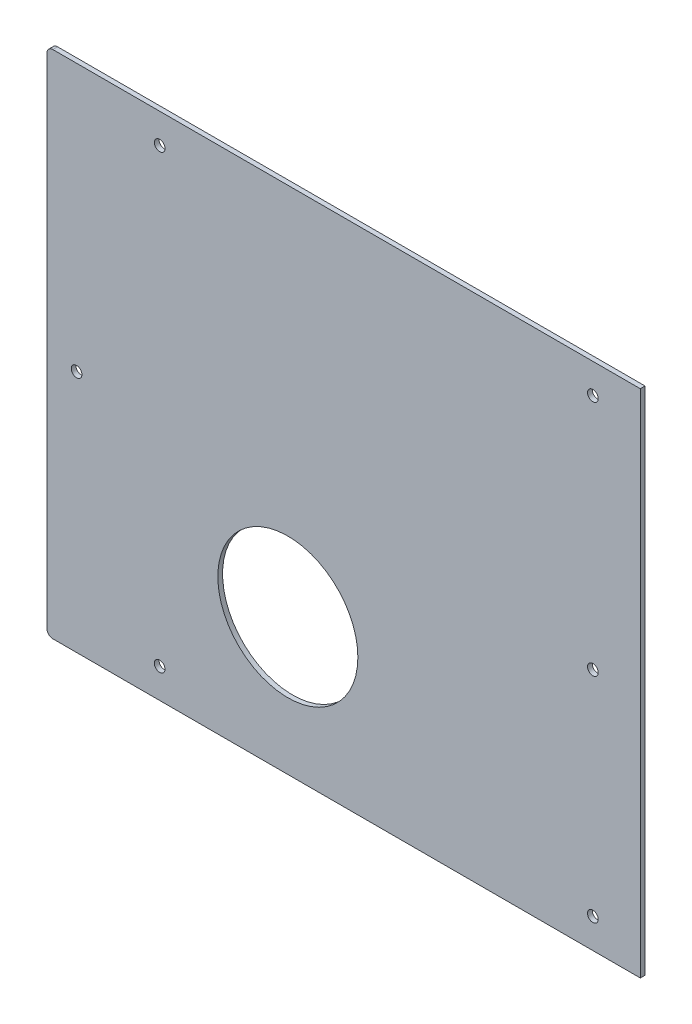
ISO-10303-21;
HEADER;
FILE_DESCRIPTION(('STEP AP214'),'2;1');
FILE_NAME('part.step','',(''),(''),'','','');
FILE_SCHEMA(('AUTOMOTIVE_DESIGN { 1 0 10303 214 1 1 1 1 }'));
ENDSEC;
DATA;
#1=APPLICATION_CONTEXT('core data for automotive mechanical design processes');
#2=APPLICATION_PROTOCOL_DEFINITION('international standard','automotive_design',2000,#1);
#3=PRODUCT_CONTEXT('',#1,'mechanical');
#4=PRODUCT('Part','Part','',(#3));
#5=PRODUCT_RELATED_PRODUCT_CATEGORY('part','',(#4));
#6=PRODUCT_DEFINITION_FORMATION('','',#4);
#7=PRODUCT_DEFINITION_CONTEXT('part definition',#1,'design');
#8=PRODUCT_DEFINITION('design','',#6,#7);
#9=PRODUCT_DEFINITION_SHAPE('','',#8);
#10=(LENGTH_UNIT() NAMED_UNIT(*) SI_UNIT(.MILLI.,.METRE.));
#11=(NAMED_UNIT(*) PLANE_ANGLE_UNIT() SI_UNIT($,.RADIAN.));
#12=(NAMED_UNIT(*) SI_UNIT($,.STERADIAN.) SOLID_ANGLE_UNIT());
#13=UNCERTAINTY_MEASURE_WITH_UNIT(LENGTH_MEASURE(1.E-05),#10,'distance_accuracy_value','');
#14=(GEOMETRIC_REPRESENTATION_CONTEXT(3) GLOBAL_UNCERTAINTY_ASSIGNED_CONTEXT((#13)) GLOBAL_UNIT_ASSIGNED_CONTEXT((#10,
#11,#12)) REPRESENTATION_CONTEXT('',''));
#15=CARTESIAN_POINT('',(0.,0.,0.));
#16=DIRECTION('',(0.,0.,1.));
#17=DIRECTION('',(1.,0.,0.));
#18=AXIS2_PLACEMENT_3D('',#15,#16,#17);
#19=CARTESIAN_POINT('',(-522.422201324328,-109.999999999997,2.));
#20=DIRECTION('',(0.,0.,1.));
#21=DIRECTION('',(1.,0.,0.));
#22=AXIS2_PLACEMENT_3D('',#19,#20,#21);
#23=PLANE('',#22);
#24=CARTESIAN_POINT('',(-545.922201324328,-160.,2.));
#25=DIRECTION('',(0.,0.,-1.));
#26=DIRECTION('',(-1.,0.,0.));
#27=AXIS2_PLACEMENT_3D('',#24,#25,#26);
#28=CIRCLE('',#27,29.5);
#29=CARTESIAN_POINT('',(-516.422201324328,-160.,2.));
#30=VERTEX_POINT('',#29);
#31=EDGE_CURVE('E212',#30,#30,#28,.T.);
#32=ORIENTED_EDGE('',*,*,#31,.T.);
#33=EDGE_LOOP('',(#32));
#34=FACE_BOUND('',#33,.T.);
#35=CARTESIAN_POINT('',(-634.922201324328,-114.999999999998,2.));
#36=DIRECTION('',(0.,0.,-1.));
#37=DIRECTION('',(-1.,0.,0.));
#38=AXIS2_PLACEMENT_3D('',#35,#36,#37);
#39=CIRCLE('',#38,2.25);
#40=CARTESIAN_POINT('',(-632.672201324328,-114.999999999998,2.));
#41=VERTEX_POINT('',#40);
#42=EDGE_CURVE('E200',#41,#41,#39,.T.);
#43=ORIENTED_EDGE('',*,*,#42,.T.);
#44=EDGE_LOOP('',(#43));
#45=FACE_BOUND('',#44,.T.);
#46=CARTESIAN_POINT('',(-417.422201324328,-205.,2.));
#47=DIRECTION('',(0.,0.,-1.));
#48=DIRECTION('',(-1.,0.,0.));
#49=AXIS2_PLACEMENT_3D('',#46,#47,#48);
#50=CIRCLE('',#49,2.25);
#51=CARTESIAN_POINT('',(-415.172201324328,-205.,2.));
#52=VERTEX_POINT('',#51);
#53=EDGE_CURVE('E217',#52,#52,#50,.T.);
#54=ORIENTED_EDGE('',*,*,#53,.T.);
#55=EDGE_LOOP('',(#54));
#56=FACE_BOUND('',#55,.T.);
#57=CARTESIAN_POINT('',(-599.922201324328,-205.,2.));
#58=DIRECTION('',(0.,0.,-1.));
#59=DIRECTION('',(-1.,0.,0.));
#60=AXIS2_PLACEMENT_3D('',#57,#58,#59);
#61=CIRCLE('',#60,2.25);
#62=CARTESIAN_POINT('',(-597.672201324328,-205.,2.));
#63=VERTEX_POINT('',#62);
#64=EDGE_CURVE('E224',#63,#63,#61,.T.);
#65=ORIENTED_EDGE('',*,*,#64,.T.);
#66=EDGE_LOOP('',(#65));
#67=FACE_BOUND('',#66,.T.);
#68=CARTESIAN_POINT('',(-417.422201324328,-14.9999999999947,2.));
#69=DIRECTION('',(0.,0.,-1.));
#70=DIRECTION('',(-1.,0.,0.));
#71=AXIS2_PLACEMENT_3D('',#68,#69,#70);
#72=CIRCLE('',#71,2.25);
#73=CARTESIAN_POINT('',(-415.172201324328,-14.9999999999947,2.));
#74=VERTEX_POINT('',#73);
#75=EDGE_CURVE('E191',#74,#74,#72,.T.);
#76=ORIENTED_EDGE('',*,*,#75,.T.);
#77=EDGE_LOOP('',(#76));
#78=FACE_BOUND('',#77,.T.);
#79=CARTESIAN_POINT('',(-417.422201324328,-115.,2.));
#80=DIRECTION('',(0.,0.,-1.));
#81=DIRECTION('',(-1.,0.,0.));
#82=AXIS2_PLACEMENT_3D('',#79,#80,#81);
#83=CIRCLE('',#82,2.25);
#84=CARTESIAN_POINT('',(-415.172201324328,-115.,2.));
#85=VERTEX_POINT('',#84);
#86=EDGE_CURVE('E190',#85,#85,#83,.T.);
#87=ORIENTED_EDGE('',*,*,#86,.T.);
#88=EDGE_LOOP('',(#87));
#89=FACE_BOUND('',#88,.T.);
#90=CARTESIAN_POINT('',(-599.922201324328,-14.9999999999947,2.));
#91=DIRECTION('',(0.,0.,-1.));
#92=DIRECTION('',(-1.,0.,0.));
#93=AXIS2_PLACEMENT_3D('',#90,#91,#92);
#94=CIRCLE('',#93,2.25);
#95=CARTESIAN_POINT('',(-597.672201324328,-14.9999999999947,2.));
#96=VERTEX_POINT('',#95);
#97=EDGE_CURVE('E192',#96,#96,#94,.T.);
#98=ORIENTED_EDGE('',*,*,#97,.T.);
#99=EDGE_LOOP('',(#98));
#100=FACE_BOUND('',#99,.T.);
#101=CARTESIAN_POINT('',(-644.922201324328,-215.,2.));
#102=DIRECTION('',(0.,0.,-1.));
#103=DIRECTION('',(-0.707106781186548,-0.707106781186548,0.));
#104=AXIS2_PLACEMENT_3D('',#101,#102,#103);
#105=CIRCLE('',#104,2.5);
#106=CARTESIAN_POINT('',(-644.922201324328,-217.5,2.));
#107=VERTEX_POINT('',#106);
#108=CARTESIAN_POINT('',(-647.422201324328,-215.,2.));
#109=VERTEX_POINT('',#108);
#110=EDGE_CURVE('E167',#107,#109,#105,.T.);
#111=ORIENTED_EDGE('',*,*,#110,.F.);
#112=DIRECTION('',(1.,0.,0.));
#113=VECTOR('',#112,1.);
#114=CARTESIAN_POINT('',(-647.422201324328,-217.5,2.));
#115=LINE('',#114,#113);
#116=CARTESIAN_POINT('',(-397.422201324328,-217.5,2.));
#117=VERTEX_POINT('',#116);
#118=EDGE_CURVE('E158',#107,#117,#115,.T.);
#119=ORIENTED_EDGE('',*,*,#118,.T.);
#120=DIRECTION('',(0.,1.,0.));
#121=VECTOR('',#120,1.);
#122=CARTESIAN_POINT('',(-397.422201324328,-217.5,2.));
#123=LINE('',#122,#121);
#124=CARTESIAN_POINT('',(-397.422201324328,-2.49999999999451,2.));
#125=VERTEX_POINT('',#124);
#126=EDGE_CURVE('E26',#117,#125,#123,.T.);
#127=ORIENTED_EDGE('',*,*,#126,.T.);
#128=DIRECTION('',(-1.,0.,0.));
#129=VECTOR('',#128,1.);
#130=CARTESIAN_POINT('',(-397.422201324328,-2.49999999999451,2.));
#131=LINE('',#130,#129);
#132=CARTESIAN_POINT('',(-644.922201324328,-2.49999999999452,2.));
#133=VERTEX_POINT('',#132);
#134=EDGE_CURVE('E176',#125,#133,#131,.T.);
#135=ORIENTED_EDGE('',*,*,#134,.T.);
#136=CARTESIAN_POINT('',(-644.922201324328,-4.99999999999452,2.));
#137=DIRECTION('',(0.,0.,-1.));
#138=DIRECTION('',(-0.707106781186548,0.707106781186547,0.));
#139=AXIS2_PLACEMENT_3D('',#136,#137,#138);
#140=CIRCLE('',#139,2.5);
#141=CARTESIAN_POINT('',(-647.422201324328,-4.99999999999453,2.));
#142=VERTEX_POINT('',#141);
#143=EDGE_CURVE('E216',#142,#133,#140,.T.);
#144=ORIENTED_EDGE('',*,*,#143,.F.);
#145=DIRECTION('',(0.,-1.,0.));
#146=VECTOR('',#145,1.);
#147=CARTESIAN_POINT('',(-647.422201324328,-2.49999999999452,2.));
#148=LINE('',#147,#146);
#149=EDGE_CURVE('E10',#142,#109,#148,.T.);
#150=ORIENTED_EDGE('',*,*,#149,.T.);
#151=EDGE_LOOP('',(#111,#119,#127,#135,#144,#150));
#152=FACE_BOUND('',#151,.T.);
#153=ADVANCED_FACE('F15',(#34,#45,#56,#67,#78,#89,#100,#152),#23,.T.);
#154=CARTESIAN_POINT('',(-647.422201324328,-2.49999999999452,0.));
#155=DIRECTION('',(-1.,0.,0.));
#156=DIRECTION('',(0.,1.,0.));
#157=AXIS2_PLACEMENT_3D('',#154,#155,#156);
#158=PLANE('',#157);
#159=DIRECTION('',(0.,0.,-1.));
#160=VECTOR('',#159,1.);
#161=CARTESIAN_POINT('',(-647.422201324328,-215.,0.));
#162=LINE('',#161,#160);
#163=CARTESIAN_POINT('',(-647.422201324328,-215.,0.));
#164=VERTEX_POINT('',#163);
#165=EDGE_CURVE('E151',#109,#164,#162,.T.);
#166=ORIENTED_EDGE('',*,*,#165,.F.);
#167=ORIENTED_EDGE('',*,*,#149,.F.);
#168=DIRECTION('',(0.,0.,1.));
#169=VECTOR('',#168,1.);
#170=CARTESIAN_POINT('',(-647.422201324328,-4.99999999999453,0.));
#171=LINE('',#170,#169);
#172=CARTESIAN_POINT('',(-647.422201324328,-4.99999999999453,0.));
#173=VERTEX_POINT('',#172);
#174=EDGE_CURVE('E153',#173,#142,#171,.T.);
#175=ORIENTED_EDGE('',*,*,#174,.F.);
#176=DIRECTION('',(0.,-1.,0.));
#177=VECTOR('',#176,1.);
#178=CARTESIAN_POINT('',(-647.422201324328,-2.49999999999452,0.));
#179=LINE('',#178,#177);
#180=EDGE_CURVE('E149',#173,#164,#179,.T.);
#181=ORIENTED_EDGE('',*,*,#180,.T.);
#182=EDGE_LOOP('',(#166,#167,#175,#181));
#183=FACE_BOUND('',#182,.T.);
#184=ADVANCED_FACE('F17',(#183),#158,.T.);
#185=CARTESIAN_POINT('',(-397.422201324328,-217.5,0.));
#186=DIRECTION('',(1.,0.,0.));
#187=DIRECTION('',(0.,1.,0.));
#188=AXIS2_PLACEMENT_3D('',#185,#186,#187);
#189=PLANE('',#188);
#190=DIRECTION('',(0.,1.,0.));
#191=VECTOR('',#190,1.);
#192=CARTESIAN_POINT('',(-397.422201324328,-217.5,0.));
#193=LINE('',#192,#191);
#194=CARTESIAN_POINT('',(-397.422201324328,-217.5,0.));
#195=VERTEX_POINT('',#194);
#196=CARTESIAN_POINT('',(-397.422201324328,-2.49999999999451,0.));
#197=VERTEX_POINT('',#196);
#198=EDGE_CURVE('E235',#195,#197,#193,.T.);
#199=ORIENTED_EDGE('',*,*,#198,.T.);
#200=DIRECTION('',(0.,0.,1.));
#201=VECTOR('',#200,1.);
#202=CARTESIAN_POINT('',(-397.422201324328,-2.49999999999451,0.));
#203=LINE('',#202,#201);
#204=EDGE_CURVE('E208',#197,#125,#203,.T.);
#205=ORIENTED_EDGE('',*,*,#204,.T.);
#206=ORIENTED_EDGE('',*,*,#126,.F.);
#207=DIRECTION('',(0.,0.,1.));
#208=VECTOR('',#207,1.);
#209=CARTESIAN_POINT('',(-397.422201324328,-217.5,0.));
#210=LINE('',#209,#208);
#211=EDGE_CURVE('E207',#195,#117,#210,.T.);
#212=ORIENTED_EDGE('',*,*,#211,.F.);
#213=EDGE_LOOP('',(#199,#205,#206,#212));
#214=FACE_BOUND('',#213,.T.);
#215=ADVANCED_FACE('F296',(#214),#189,.T.);
#216=CARTESIAN_POINT('',(-599.922201324328,-14.9999999999947,0.));
#217=DIRECTION('',(0.,0.,1.));
#218=DIRECTION('',(-1.,0.,0.));
#219=AXIS2_PLACEMENT_3D('',#216,#217,#218);
#220=CYLINDRICAL_SURFACE('',#219,2.25);
#221=ORIENTED_EDGE('',*,*,#97,.F.);
#222=DIRECTION('',(0.,0.,-1.));
#223=VECTOR('',#222,1.);
#224=CARTESIAN_POINT('',(-597.672201324328,-14.9999999999947,0.));
#225=LINE('',#224,#223);
#226=CARTESIAN_POINT('',(-597.672201324328,-14.9999999999947,0.));
#227=VERTEX_POINT('',#226);
#228=EDGE_CURVE('E40',#96,#227,#225,.T.);
#229=ORIENTED_EDGE('',*,*,#228,.T.);
#230=CARTESIAN_POINT('',(-599.922201324328,-14.9999999999947,0.));
#231=DIRECTION('',(0.,0.,-1.));
#232=DIRECTION('',(-1.,0.,0.));
#233=AXIS2_PLACEMENT_3D('',#230,#231,#232);
#234=CIRCLE('',#233,2.25);
#235=EDGE_CURVE('E230',#227,#227,#234,.T.);
#236=ORIENTED_EDGE('',*,*,#235,.T.);
#237=ORIENTED_EDGE('',*,*,#228,.F.);
#238=EDGE_LOOP('',(#221,#229,#236,#237));
#239=FACE_BOUND('',#238,.T.);
#240=ADVANCED_FACE('F507',(#239),#220,.F.);
#241=CARTESIAN_POINT('',(-417.422201324328,-115.,0.));
#242=DIRECTION('',(0.,0.,1.));
#243=DIRECTION('',(-1.,0.,0.));
#244=AXIS2_PLACEMENT_3D('',#241,#242,#243);
#245=CYLINDRICAL_SURFACE('',#244,2.25);
#246=ORIENTED_EDGE('',*,*,#86,.F.);
#247=DIRECTION('',(0.,0.,-1.));
#248=VECTOR('',#247,1.);
#249=CARTESIAN_POINT('',(-415.172201324328,-115.,0.));
#250=LINE('',#249,#248);
#251=CARTESIAN_POINT('',(-415.172201324328,-115.,0.));
#252=VERTEX_POINT('',#251);
#253=EDGE_CURVE('E195',#85,#252,#250,.T.);
#254=ORIENTED_EDGE('',*,*,#253,.T.);
#255=CARTESIAN_POINT('',(-417.422201324328,-115.,0.));
#256=DIRECTION('',(0.,0.,-1.));
#257=DIRECTION('',(-1.,0.,0.));
#258=AXIS2_PLACEMENT_3D('',#255,#256,#257);
#259=CIRCLE('',#258,2.25);
#260=EDGE_CURVE('E225',#252,#252,#259,.T.);
#261=ORIENTED_EDGE('',*,*,#260,.T.);
#262=ORIENTED_EDGE('',*,*,#253,.F.);
#263=EDGE_LOOP('',(#246,#254,#261,#262));
#264=FACE_BOUND('',#263,.T.);
#265=ADVANCED_FACE('F467',(#264),#245,.F.);
#266=CARTESIAN_POINT('',(-417.422201324328,-14.9999999999947,0.));
#267=DIRECTION('',(0.,0.,1.));
#268=DIRECTION('',(-1.,0.,0.));
#269=AXIS2_PLACEMENT_3D('',#266,#267,#268);
#270=CYLINDRICAL_SURFACE('',#269,2.25);
#271=ORIENTED_EDGE('',*,*,#75,.F.);
#272=DIRECTION('',(0.,0.,-1.));
#273=VECTOR('',#272,1.);
#274=CARTESIAN_POINT('',(-415.172201324328,-14.9999999999947,0.));
#275=LINE('',#274,#273);
#276=CARTESIAN_POINT('',(-415.172201324328,-14.9999999999947,0.));
#277=VERTEX_POINT('',#276);
#278=EDGE_CURVE('E187',#74,#277,#275,.T.);
#279=ORIENTED_EDGE('',*,*,#278,.T.);
#280=CARTESIAN_POINT('',(-417.422201324328,-14.9999999999947,0.));
#281=DIRECTION('',(0.,0.,-1.));
#282=DIRECTION('',(-1.,0.,0.));
#283=AXIS2_PLACEMENT_3D('',#280,#281,#282);
#284=CIRCLE('',#283,2.25);
#285=EDGE_CURVE('E229',#277,#277,#284,.T.);
#286=ORIENTED_EDGE('',*,*,#285,.T.);
#287=ORIENTED_EDGE('',*,*,#278,.F.);
#288=EDGE_LOOP('',(#271,#279,#286,#287));
#289=FACE_BOUND('',#288,.T.);
#290=ADVANCED_FACE('F461',(#289),#270,.F.);
#291=CARTESIAN_POINT('',(-599.922201324328,-205.,0.));
#292=DIRECTION('',(0.,0.,1.));
#293=DIRECTION('',(-1.,0.,0.));
#294=AXIS2_PLACEMENT_3D('',#291,#292,#293);
#295=CYLINDRICAL_SURFACE('',#294,2.25);
#296=ORIENTED_EDGE('',*,*,#64,.F.);
#297=DIRECTION('',(0.,0.,-1.));
#298=VECTOR('',#297,1.);
#299=CARTESIAN_POINT('',(-597.672201324328,-205.,0.));
#300=LINE('',#299,#298);
#301=CARTESIAN_POINT('',(-597.672201324328,-205.,0.));
#302=VERTEX_POINT('',#301);
#303=EDGE_CURVE('E236',#63,#302,#300,.T.);
#304=ORIENTED_EDGE('',*,*,#303,.T.);
#305=CARTESIAN_POINT('',(-599.922201324328,-205.,0.));
#306=DIRECTION('',(0.,0.,-1.));
#307=DIRECTION('',(-1.,0.,0.));
#308=AXIS2_PLACEMENT_3D('',#305,#306,#307);
#309=CIRCLE('',#308,2.25);
#310=EDGE_CURVE('E185',#302,#302,#309,.T.);
#311=ORIENTED_EDGE('',*,*,#310,.T.);
#312=ORIENTED_EDGE('',*,*,#303,.F.);
#313=EDGE_LOOP('',(#296,#304,#311,#312));
#314=FACE_BOUND('',#313,.T.);
#315=ADVANCED_FACE('F466',(#314),#295,.F.);
#316=CARTESIAN_POINT('',(-417.422201324328,-205.,0.));
#317=DIRECTION('',(0.,0.,1.));
#318=DIRECTION('',(-1.,0.,0.));
#319=AXIS2_PLACEMENT_3D('',#316,#317,#318);
#320=CYLINDRICAL_SURFACE('',#319,2.25);
#321=ORIENTED_EDGE('',*,*,#53,.F.);
#322=DIRECTION('',(0.,0.,-1.));
#323=VECTOR('',#322,1.);
#324=CARTESIAN_POINT('',(-415.172201324328,-205.,0.));
#325=LINE('',#324,#323);
#326=CARTESIAN_POINT('',(-415.172201324328,-205.,0.));
#327=VERTEX_POINT('',#326);
#328=EDGE_CURVE('E221',#52,#327,#325,.T.);
#329=ORIENTED_EDGE('',*,*,#328,.T.);
#330=CARTESIAN_POINT('',(-417.422201324328,-205.,0.));
#331=DIRECTION('',(0.,0.,-1.));
#332=DIRECTION('',(-1.,0.,0.));
#333=AXIS2_PLACEMENT_3D('',#330,#331,#332);
#334=CIRCLE('',#333,2.25);
#335=EDGE_CURVE('E181',#327,#327,#334,.T.);
#336=ORIENTED_EDGE('',*,*,#335,.T.);
#337=ORIENTED_EDGE('',*,*,#328,.F.);
#338=EDGE_LOOP('',(#321,#329,#336,#337));
#339=FACE_BOUND('',#338,.T.);
#340=ADVANCED_FACE('F452',(#339),#320,.F.);
#341=CARTESIAN_POINT('',(-634.922201324328,-114.999999999998,0.));
#342=DIRECTION('',(0.,0.,1.));
#343=DIRECTION('',(-1.,0.,0.));
#344=AXIS2_PLACEMENT_3D('',#341,#342,#343);
#345=CYLINDRICAL_SURFACE('',#344,2.25);
#346=ORIENTED_EDGE('',*,*,#42,.F.);
#347=DIRECTION('',(0.,0.,-1.));
#348=VECTOR('',#347,1.);
#349=CARTESIAN_POINT('',(-632.672201324328,-114.999999999998,0.));
#350=LINE('',#349,#348);
#351=CARTESIAN_POINT('',(-632.672201324328,-114.999999999998,0.));
#352=VERTEX_POINT('',#351);
#353=EDGE_CURVE('E204',#41,#352,#350,.T.);
#354=ORIENTED_EDGE('',*,*,#353,.T.);
#355=CARTESIAN_POINT('',(-634.922201324328,-114.999999999998,0.));
#356=DIRECTION('',(0.,0.,-1.));
#357=DIRECTION('',(-1.,0.,0.));
#358=AXIS2_PLACEMENT_3D('',#355,#356,#357);
#359=CIRCLE('',#358,2.25);
#360=EDGE_CURVE('E184',#352,#352,#359,.T.);
#361=ORIENTED_EDGE('',*,*,#360,.T.);
#362=ORIENTED_EDGE('',*,*,#353,.F.);
#363=EDGE_LOOP('',(#346,#354,#361,#362));
#364=FACE_BOUND('',#363,.T.);
#365=ADVANCED_FACE('F446',(#364),#345,.F.);
#366=CARTESIAN_POINT('',(-545.922201324328,-160.,0.));
#367=DIRECTION('',(0.,0.,1.));
#368=DIRECTION('',(-1.,0.,0.));
#369=AXIS2_PLACEMENT_3D('',#366,#367,#368);
#370=CYLINDRICAL_SURFACE('',#369,29.5);
#371=ORIENTED_EDGE('',*,*,#31,.F.);
#372=DIRECTION('',(0.,0.,-1.));
#373=VECTOR('',#372,1.);
#374=CARTESIAN_POINT('',(-516.422201324328,-160.,0.));
#375=LINE('',#374,#373);
#376=CARTESIAN_POINT('',(-516.422201324328,-160.,0.));
#377=VERTEX_POINT('',#376);
#378=EDGE_CURVE('E101',#30,#377,#375,.T.);
#379=ORIENTED_EDGE('',*,*,#378,.T.);
#380=CARTESIAN_POINT('',(-545.922201324328,-160.,0.));
#381=DIRECTION('',(0.,0.,-1.));
#382=DIRECTION('',(-1.,0.,0.));
#383=AXIS2_PLACEMENT_3D('',#380,#381,#382);
#384=CIRCLE('',#383,29.5);
#385=EDGE_CURVE('E199',#377,#377,#384,.T.);
#386=ORIENTED_EDGE('',*,*,#385,.T.);
#387=ORIENTED_EDGE('',*,*,#378,.F.);
#388=EDGE_LOOP('',(#371,#379,#386,#387));
#389=FACE_BOUND('',#388,.T.);
#390=ADVANCED_FACE('F451',(#389),#370,.F.);
#391=CARTESIAN_POINT('',(-397.422201324328,-2.49999999999451,0.));
#392=DIRECTION('',(0.,1.,0.));
#393=DIRECTION('',(1.,0.,0.));
#394=AXIS2_PLACEMENT_3D('',#391,#392,#393);
#395=PLANE('',#394);
#396=DIRECTION('',(0.,0.,-1.));
#397=VECTOR('',#396,1.);
#398=CARTESIAN_POINT('',(-644.922201324328,-2.49999999999452,0.));
#399=LINE('',#398,#397);
#400=CARTESIAN_POINT('',(-644.922201324328,-2.49999999999452,0.));
#401=VERTEX_POINT('',#400);
#402=EDGE_CURVE('E213',#133,#401,#399,.T.);
#403=ORIENTED_EDGE('',*,*,#402,.F.);
#404=ORIENTED_EDGE('',*,*,#134,.F.);
#405=ORIENTED_EDGE('',*,*,#204,.F.);
#406=DIRECTION('',(-1.,0.,0.));
#407=VECTOR('',#406,1.);
#408=CARTESIAN_POINT('',(-397.422201324328,-2.49999999999451,0.));
#409=LINE('',#408,#407);
#410=EDGE_CURVE('E231',#197,#401,#409,.T.);
#411=ORIENTED_EDGE('',*,*,#410,.T.);
#412=EDGE_LOOP('',(#403,#404,#405,#411));
#413=FACE_BOUND('',#412,.T.);
#414=ADVANCED_FACE('F308',(#413),#395,.T.);
#415=CARTESIAN_POINT('',(-644.922201324328,-4.99999999999452,0.));
#416=DIRECTION('',(0.,0.,1.));
#417=DIRECTION('',(-0.707106781186548,0.707106781186547,0.));
#418=AXIS2_PLACEMENT_3D('',#415,#416,#417);
#419=CYLINDRICAL_SURFACE('',#418,2.5);
#420=ORIENTED_EDGE('',*,*,#143,.T.);
#421=ORIENTED_EDGE('',*,*,#402,.T.);
#422=CARTESIAN_POINT('',(-644.922201324328,-4.99999999999452,0.));
#423=DIRECTION('',(0.,0.,1.));
#424=DIRECTION('',(-0.707106781186548,0.707106781186547,0.));
#425=AXIS2_PLACEMENT_3D('',#422,#423,#424);
#426=CIRCLE('',#425,2.5);
#427=EDGE_CURVE('E157',#401,#173,#426,.T.);
#428=ORIENTED_EDGE('',*,*,#427,.T.);
#429=ORIENTED_EDGE('',*,*,#174,.T.);
#430=EDGE_LOOP('',(#420,#421,#428,#429));
#431=FACE_BOUND('',#430,.T.);
#432=ADVANCED_FACE('F306',(#431),#419,.T.);
#433=CARTESIAN_POINT('',(-522.422201324328,-109.999999999997,0.));
#434=DIRECTION('',(0.,0.,1.));
#435=DIRECTION('',(1.,0.,0.));
#436=AXIS2_PLACEMENT_3D('',#433,#434,#435);
#437=PLANE('',#436);
#438=ORIENTED_EDGE('',*,*,#385,.F.);
#439=EDGE_LOOP('',(#438));
#440=FACE_BOUND('',#439,.T.);
#441=ORIENTED_EDGE('',*,*,#360,.F.);
#442=EDGE_LOOP('',(#441));
#443=FACE_BOUND('',#442,.T.);
#444=ORIENTED_EDGE('',*,*,#335,.F.);
#445=EDGE_LOOP('',(#444));
#446=FACE_BOUND('',#445,.T.);
#447=ORIENTED_EDGE('',*,*,#310,.F.);
#448=EDGE_LOOP('',(#447));
#449=FACE_BOUND('',#448,.T.);
#450=ORIENTED_EDGE('',*,*,#285,.F.);
#451=EDGE_LOOP('',(#450));
#452=FACE_BOUND('',#451,.T.);
#453=ORIENTED_EDGE('',*,*,#260,.F.);
#454=EDGE_LOOP('',(#453));
#455=FACE_BOUND('',#454,.T.);
#456=ORIENTED_EDGE('',*,*,#235,.F.);
#457=EDGE_LOOP('',(#456));
#458=FACE_BOUND('',#457,.T.);
#459=CARTESIAN_POINT('',(-644.922201324328,-215.,0.));
#460=DIRECTION('',(0.,0.,1.));
#461=DIRECTION('',(-0.707106781186548,-0.707106781186548,0.));
#462=AXIS2_PLACEMENT_3D('',#459,#460,#461);
#463=CIRCLE('',#462,2.5);
#464=CARTESIAN_POINT('',(-644.922201324328,-217.5,0.));
#465=VERTEX_POINT('',#464);
#466=EDGE_CURVE('E19',#164,#465,#463,.T.);
#467=ORIENTED_EDGE('',*,*,#466,.F.);
#468=ORIENTED_EDGE('',*,*,#180,.F.);
#469=ORIENTED_EDGE('',*,*,#427,.F.);
#470=ORIENTED_EDGE('',*,*,#410,.F.);
#471=ORIENTED_EDGE('',*,*,#198,.F.);
#472=DIRECTION('',(1.,0.,0.));
#473=VECTOR('',#472,1.);
#474=CARTESIAN_POINT('',(-647.422201324328,-217.5,0.));
#475=LINE('',#474,#473);
#476=EDGE_CURVE('E140',#465,#195,#475,.T.);
#477=ORIENTED_EDGE('',*,*,#476,.F.);
#478=EDGE_LOOP('',(#467,#468,#469,#470,#471,#477));
#479=FACE_BOUND('',#478,.T.);
#480=ADVANCED_FACE('F160',(#440,#443,#446,#449,#452,#455,#458,#479),#437,.F.);
#481=CARTESIAN_POINT('',(-647.422201324328,-217.5,0.));
#482=DIRECTION('',(0.,-1.,0.));
#483=DIRECTION('',(0.,0.,-1.));
#484=AXIS2_PLACEMENT_3D('',#481,#482,#483);
#485=PLANE('',#484);
#486=DIRECTION('',(0.,0.,1.));
#487=VECTOR('',#486,1.);
#488=CARTESIAN_POINT('',(-644.922201324328,-217.5,0.));
#489=LINE('',#488,#487);
#490=EDGE_CURVE('E164',#465,#107,#489,.T.);
#491=ORIENTED_EDGE('',*,*,#490,.F.);
#492=ORIENTED_EDGE('',*,*,#476,.T.);
#493=ORIENTED_EDGE('',*,*,#211,.T.);
#494=ORIENTED_EDGE('',*,*,#118,.F.);
#495=EDGE_LOOP('',(#491,#492,#493,#494));
#496=FACE_BOUND('',#495,.T.);
#497=ADVANCED_FACE('F292',(#496),#485,.T.);
#498=CARTESIAN_POINT('',(-644.922201324328,-215.,0.));
#499=DIRECTION('',(0.,0.,1.));
#500=DIRECTION('',(-0.707106781186548,-0.707106781186548,0.));
#501=AXIS2_PLACEMENT_3D('',#498,#499,#500);
#502=CYLINDRICAL_SURFACE('',#501,2.5);
#503=ORIENTED_EDGE('',*,*,#110,.T.);
#504=ORIENTED_EDGE('',*,*,#165,.T.);
#505=ORIENTED_EDGE('',*,*,#466,.T.);
#506=ORIENTED_EDGE('',*,*,#490,.T.);
#507=EDGE_LOOP('',(#503,#504,#505,#506));
#508=FACE_BOUND('',#507,.T.);
#509=ADVANCED_FACE('F165',(#508),#502,.T.);
#510=CLOSED_SHELL('',(#153,#184,#215,#240,#265,#290,#315,#340,#365,#390,#414,#432,#480,#497,#509));
#511=MANIFOLD_SOLID_BREP('B1',#510);
#512=ADVANCED_BREP_SHAPE_REPRESENTATION('',(#18,#511),#14);
#513=SHAPE_DEFINITION_REPRESENTATION(#9,#512);
ENDSEC;
END-ISO-10303-21;
